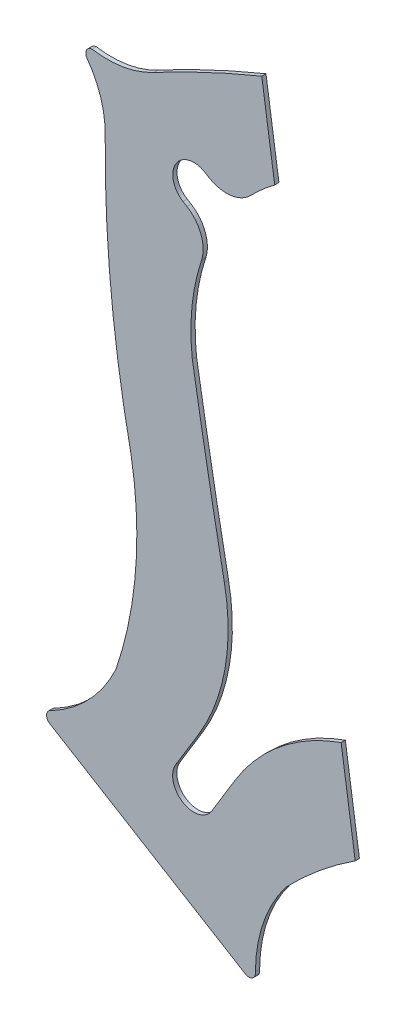
ISO-10303-21;
HEADER;
FILE_DESCRIPTION(('STEP AP214'),'2;1');
FILE_NAME('part.step','',(''),(''),'','','');
FILE_SCHEMA(('AUTOMOTIVE_DESIGN { 1 0 10303 214 1 1 1 1 }'));
ENDSEC;
DATA;
#1=APPLICATION_CONTEXT('core data for automotive mechanical design processes');
#2=APPLICATION_PROTOCOL_DEFINITION('international standard','automotive_design',2000,#1);
#3=PRODUCT_CONTEXT('',#1,'mechanical');
#4=PRODUCT('Part','Part','',(#3));
#5=PRODUCT_RELATED_PRODUCT_CATEGORY('part','',(#4));
#6=PRODUCT_DEFINITION_FORMATION('','',#4);
#7=PRODUCT_DEFINITION_CONTEXT('part definition',#1,'design');
#8=PRODUCT_DEFINITION('design','',#6,#7);
#9=PRODUCT_DEFINITION_SHAPE('','',#8);
#10=(LENGTH_UNIT() NAMED_UNIT(*) SI_UNIT(.MILLI.,.METRE.));
#11=(NAMED_UNIT(*) PLANE_ANGLE_UNIT() SI_UNIT($,.RADIAN.));
#12=(NAMED_UNIT(*) SI_UNIT($,.STERADIAN.) SOLID_ANGLE_UNIT());
#13=UNCERTAINTY_MEASURE_WITH_UNIT(LENGTH_MEASURE(1.E-05),#10,'distance_accuracy_value','');
#14=(GEOMETRIC_REPRESENTATION_CONTEXT(3) GLOBAL_UNCERTAINTY_ASSIGNED_CONTEXT((#13)) GLOBAL_UNIT_ASSIGNED_CONTEXT((#10,
#11,#12)) REPRESENTATION_CONTEXT('',''));
#15=CARTESIAN_POINT('',(0.,0.,0.));
#16=DIRECTION('',(0.,0.,1.));
#17=DIRECTION('',(1.,0.,0.));
#18=AXIS2_PLACEMENT_3D('',#15,#16,#17);
#19=CARTESIAN_POINT('',(-600.745447716728,679.701236138692,0.));
#20=DIRECTION('',(-0.989272155517059,-0.14608423021884,0.));
#21=DIRECTION('',(0.146084230218841,-0.989272155517059,0.));
#22=AXIS2_PLACEMENT_3D('',#19,#20,#21);
#23=PLANE('',#22);
#24=DIRECTION('',(0.146084230218841,-0.989272155517059,0.));
#25=VECTOR('',#24,1.);
#26=CARTESIAN_POINT('',(-231.23791311845,-1822.57785780754,6.35));
#27=LINE('',#26,#25);
#28=CARTESIAN_POINT('',(-591.383250780429,616.301095482348,6.35));
#29=VERTEX_POINT('',#28);
#30=CARTESIAN_POINT('',(-571.935506563414,484.602336398707,6.35));
#31=VERTEX_POINT('',#30);
#32=EDGE_CURVE('E38',#29,#31,#27,.T.);
#33=ORIENTED_EDGE('',*,*,#32,.T.);
#34=DIRECTION('',(0.,0.,-1.));
#35=VECTOR('',#34,1.);
#36=CARTESIAN_POINT('',(-571.935506563414,484.602336398707,6.35));
#37=LINE('',#36,#35);
#38=CARTESIAN_POINT('',(-571.935506563414,484.602336398707,0.));
#39=VERTEX_POINT('',#38);
#40=EDGE_CURVE('E296',#31,#39,#37,.T.);
#41=ORIENTED_EDGE('',*,*,#40,.T.);
#42=DIRECTION('',(0.146084230218841,-0.989272155517059,0.));
#43=VECTOR('',#42,1.);
#44=CARTESIAN_POINT('',(-231.23791311845,-1822.57785780754,0.));
#45=LINE('',#44,#43);
#46=CARTESIAN_POINT('',(-591.383250780429,616.301095482348,0.));
#47=VERTEX_POINT('',#46);
#48=EDGE_CURVE('E290',#47,#39,#45,.T.);
#49=ORIENTED_EDGE('',*,*,#48,.F.);
#50=DIRECTION('',(0.,0.,-1.));
#51=VECTOR('',#50,1.);
#52=CARTESIAN_POINT('',(-591.383250780429,616.301095482348,6.35));
#53=LINE('',#52,#51);
#54=EDGE_CURVE('E291',#29,#47,#53,.T.);
#55=ORIENTED_EDGE('',*,*,#54,.F.);
#56=EDGE_LOOP('',(#33,#41,#49,#55));
#57=FACE_BOUND('',#56,.T.);
#58=ADVANCED_FACE('F34',(#57),#23,.F.);
#59=DIRECTION('',(0.,0.,-1.));
#60=VECTOR('',#59,1.);
#61=CARTESIAN_POINT('',(-451.112265587926,-333.604172663373,6.35));
#62=LINE('',#61,#60);
#63=CARTESIAN_POINT('',(-451.112265587926,-333.604172663373,6.35));
#64=VERTEX_POINT('',#63);
#65=CARTESIAN_POINT('',(-451.112265587926,-333.604172663373,0.));
#66=VERTEX_POINT('',#65);
#67=EDGE_CURVE('E295',#64,#66,#62,.T.);
#68=ORIENTED_EDGE('',*,*,#67,.T.);
#69=CARTESIAN_POINT('',(-472.255241426129,-190.425424004661,0.));
#70=VERTEX_POINT('',#69);
#71=EDGE_CURVE('E286',#70,#66,#45,.T.);
#72=ORIENTED_EDGE('',*,*,#71,.F.);
#73=DIRECTION('',(0.,0.,-1.));
#74=VECTOR('',#73,1.);
#75=CARTESIAN_POINT('',(-472.255241426129,-190.425424004661,6.35));
#76=LINE('',#75,#74);
#77=CARTESIAN_POINT('',(-472.255241426129,-190.425424004661,6.35));
#78=VERTEX_POINT('',#77);
#79=EDGE_CURVE('E294',#78,#70,#76,.T.);
#80=ORIENTED_EDGE('',*,*,#79,.F.);
#81=EDGE_CURVE('E321',#78,#64,#27,.T.);
#82=ORIENTED_EDGE('',*,*,#81,.T.);
#83=EDGE_LOOP('',(#68,#72,#80,#82));
#84=FACE_BOUND('',#83,.T.);
#85=ADVANCED_FACE('F317',(#84),#23,.F.);
#86=CARTESIAN_POINT('',(-171.293236978546,-1813.72592376616,6.35));
#87=DIRECTION('',(0.,0.,1.));
#88=DIRECTION('',(1.,0.,0.));
#89=AXIS2_PLACEMENT_3D('',#86,#87,#88);
#90=PLANE('',#89);
#91=ORIENTED_EDGE('',*,*,#32,.F.);
#92=CARTESIAN_POINT('',(110.064895271897,-1087.99237658831,6.35));
#93=DIRECTION('',(0.,0.,1.));
#94=DIRECTION('',(1.,0.,0.));
#95=AXIS2_PLACEMENT_3D('',#92,#93,#94);
#96=CIRCLE('',#95,1842.99911571951);
#97=CARTESIAN_POINT('',(-752.86597428118,540.502651010876,6.35));
#98=VERTEX_POINT('',#97);
#99=EDGE_CURVE('E258',#29,#98,#96,.T.);
#100=ORIENTED_EDGE('',*,*,#99,.T.);
#101=CARTESIAN_POINT('',(-823.095678809118,666.293875778942,6.35));
#102=DIRECTION('',(0.,0.,1.));
#103=DIRECTION('',(1.,0.,0.));
#104=AXIS2_PLACEMENT_3D('',#101,#102,#103);
#105=CIRCLE('',#104,144.068190891438);
#106=CARTESIAN_POINT('',(-846.063879013175,524.068331638242,6.35));
#107=VERTEX_POINT('',#106);
#108=EDGE_CURVE('E255',#107,#98,#105,.T.);
#109=ORIENTED_EDGE('',*,*,#108,.F.);
#110=CARTESIAN_POINT('',(-845.517589964065,514.069431469444,6.35));
#111=DIRECTION('',(0.,0.,1.));
#112=DIRECTION('',(1.,0.,0.));
#113=AXIS2_PLACEMENT_3D('',#110,#111,#112);
#114=CIRCLE('',#113,10.0138122765892);
#115=CARTESIAN_POINT('',(-854.64607479953,509.952733652118,6.35));
#116=VERTEX_POINT('',#115);
#117=EDGE_CURVE('E253',#107,#116,#114,.T.);
#118=ORIENTED_EDGE('',*,*,#117,.T.);
#119=CARTESIAN_POINT('',(-970.34416603136,424.106386542705,6.35));
#120=DIRECTION('',(0.,0.,1.));
#121=DIRECTION('',(1.,0.,0.));
#122=AXIS2_PLACEMENT_3D('',#119,#120,#121);
#123=CIRCLE('',#122,144.068190891392);
#124=CARTESIAN_POINT('',(-826.34498388287,419.647780563352,6.35));
#125=VERTEX_POINT('',#124);
#126=EDGE_CURVE('E250',#125,#116,#123,.T.);
#127=ORIENTED_EDGE('',*,*,#126,.F.);
#128=CARTESIAN_POINT('',(1016.57894003675,402.999922214724,6.35));
#129=DIRECTION('',(0.,0.,1.));
#130=DIRECTION('',(1.,0.,0.));
#131=AXIS2_PLACEMENT_3D('',#128,#129,#130);
#132=CIRCLE('',#131,1842.99911571951);
#133=CARTESIAN_POINT('',(-787.492762656463,26.2094869798327,6.35));
#134=VERTEX_POINT('',#133);
#135=EDGE_CURVE('E248',#125,#134,#132,.T.);
#136=ORIENTED_EDGE('',*,*,#135,.T.);
#137=CARTESIAN_POINT('',(-1369.16408540414,-74.3343643046313,6.35));
#138=DIRECTION('',(0.,0.,1.));
#139=DIRECTION('',(1.,0.,0.));
#140=AXIS2_PLACEMENT_3D('',#137,#138,#139);
#141=CIRCLE('',#140,590.297038564615);
#142=CARTESIAN_POINT('',(-810.194701221515,-264.081093616758,6.35));
#143=VERTEX_POINT('',#142);
#144=EDGE_CURVE('E245',#143,#134,#141,.T.);
#145=ORIENTED_EDGE('',*,*,#144,.F.);
#146=CARTESIAN_POINT('',(-1009.80855362237,-171.875627095615,6.35));
#147=DIRECTION('',(0.,0.,1.));
#148=DIRECTION('',(1.,0.,0.));
#149=AXIS2_PLACEMENT_3D('',#146,#147,#148);
#150=CIRCLE('',#149,219.880736142784);
#151=CARTESIAN_POINT('',(-907.272518096596,-366.385008733996,6.35));
#152=VERTEX_POINT('',#151);
#153=EDGE_CURVE('E242',#152,#143,#150,.T.);
#154=ORIENTED_EDGE('',*,*,#153,.F.);
#155=CARTESIAN_POINT('',(-904.383283640642,-375.972957449347,6.35));
#156=DIRECTION('',(0.,0.,1.));
#157=DIRECTION('',(1.,0.,0.));
#158=AXIS2_PLACEMENT_3D('',#155,#156,#157);
#159=CIRCLE('',#158,10.0138122765347);
#160=CARTESIAN_POINT('',(-909.585552112732,-384.529407592602,6.35));
#161=VERTEX_POINT('',#160);
#162=EDGE_CURVE('E240',#152,#161,#159,.T.);
#163=ORIENTED_EDGE('',*,*,#162,.T.);
#164=DIRECTION('',(-0.854464803909382,0.519509286615842,0.));
#165=VECTOR('',#164,1.);
#166=CARTESIAN_POINT('',(263.872889372188,-1097.98484194168,6.35));
#167=LINE('',#166,#165);
#168=CARTESIAN_POINT('',(-615.960664731816,-563.051512983046,6.35));
#169=VERTEX_POINT('',#168);
#170=EDGE_CURVE('E237',#169,#161,#167,.T.);
#171=ORIENTED_EDGE('',*,*,#170,.F.);
#172=CARTESIAN_POINT('',(-610.758396259745,-554.495062839782,6.35));
#173=DIRECTION('',(0.,0.,1.));
#174=DIRECTION('',(1.,0.,0.));
#175=AXIS2_PLACEMENT_3D('',#172,#173,#174);
#176=CIRCLE('',#175,10.0138122765345);
#177=CARTESIAN_POINT('',(-600.91648528871,-552.647571365407,6.35));
#178=VERTEX_POINT('',#177);
#179=EDGE_CURVE('E234',#169,#178,#176,.T.);
#180=ORIENTED_EDGE('',*,*,#179,.T.);
#181=CARTESIAN_POINT('',(-381.040967339587,-554.162409070056,6.35));
#182=DIRECTION('',(0.,0.,1.));
#183=DIRECTION('',(1.,0.,0.));
#184=AXIS2_PLACEMENT_3D('',#181,#182,#183);
#185=CIRCLE('',#184,219.880736142757);
#186=CARTESIAN_POINT('',(-554.76775075728,-419.379090925625,6.35));
#187=VERTEX_POINT('',#186);
#188=EDGE_CURVE('E231',#187,#178,#185,.T.);
#189=ORIENTED_EDGE('',*,*,#188,.F.);
#190=CARTESIAN_POINT('',(-129.060690383093,-828.309515919683,6.35));
#191=DIRECTION('',(0.,0.,1.));
#192=DIRECTION('',(1.,0.,0.));
#193=AXIS2_PLACEMENT_3D('',#190,#191,#192);
#194=CIRCLE('',#193,590.297038564702);
#195=EDGE_CURVE('E235',#64,#187,#194,.T.);
#196=ORIENTED_EDGE('',*,*,#195,.F.);
#197=ORIENTED_EDGE('',*,*,#81,.F.);
#198=CARTESIAN_POINT('',(-371.51964822107,-478.097772800309,6.35));
#199=DIRECTION('',(0.,0.,1.));
#200=DIRECTION('',(1.,0.,0.));
#201=AXIS2_PLACEMENT_3D('',#198,#199,#200);
#202=CIRCLE('',#201,304.799999999967);
#203=CARTESIAN_POINT('',(-631.960520452372,-319.751342239341,6.35));
#204=VERTEX_POINT('',#203);
#205=EDGE_CURVE('E133',#78,#204,#202,.T.);
#206=ORIENTED_EDGE('',*,*,#205,.T.);
#207=DIRECTION('',(0.51950928661732,0.854464803908484,0.));
#208=VECTOR('',#207,1.);
#209=CARTESIAN_POINT('',(-1170.80997724912,-1206.02596195983,6.35));
#210=LINE('',#209,#208);
#211=CARTESIAN_POINT('',(-666.28027127014,-376.198878227843,6.35));
#212=VERTEX_POINT('',#211);
#213=EDGE_CURVE('E284',#212,#204,#210,.T.);
#214=ORIENTED_EDGE('',*,*,#213,.F.);
#215=CARTESIAN_POINT('',(-693.40952879447,-359.704458377662,6.35));
#216=DIRECTION('',(0.,0.,1.));
#217=DIRECTION('',(1.,0.,0.));
#218=AXIS2_PLACEMENT_3D('',#215,#216,#217);
#219=CIRCLE('',#218,31.7500000002429);
#220=CARTESIAN_POINT('',(-720.538786318799,-343.210038527483,6.35));
#221=VERTEX_POINT('',#220);
#222=EDGE_CURVE('E282',#221,#212,#219,.T.);
#223=ORIENTED_EDGE('',*,*,#222,.F.);
#224=DIRECTION('',(0.51950928661783,0.854464803908174,0.));
#225=VECTOR('',#224,1.);
#226=CARTESIAN_POINT('',(-1225.06849229784,-1173.03712225845,6.35));
#227=LINE('',#226,#225);
#228=CARTESIAN_POINT('',(-686.219035501725,-286.762502540197,6.35));
#229=VERTEX_POINT('',#228);
#230=EDGE_CURVE('E210',#221,#229,#227,.T.);
#231=ORIENTED_EDGE('',*,*,#230,.T.);
#232=CARTESIAN_POINT('',(-946.659907733025,-128.416071979231,6.35));
#233=DIRECTION('',(0.,0.,1.));
#234=DIRECTION('',(1.,0.,0.));
#235=AXIS2_PLACEMENT_3D('',#232,#233,#234);
#236=CIRCLE('',#235,304.799999999966);
#237=CARTESIAN_POINT('',(-647.527286884587,-69.912096521807,6.35));
#238=VERTEX_POINT('',#237);
#239=EDGE_CURVE('E279',#229,#238,#236,.T.);
#240=ORIENTED_EDGE('',*,*,#239,.T.);
#241=CARTESIAN_POINT('',(8561.11829264849,1731.10303067193,6.35));
#242=DIRECTION('',(0.,0.,1.));
#243=DIRECTION('',(1.,0.,0.));
#244=AXIS2_PLACEMENT_3D('',#241,#242,#243);
#245=CIRCLE('',#244,9383.11296414121);
#246=CARTESIAN_POINT('',(-695.643154418037,196.444628962587,6.35));
#247=VERTEX_POINT('',#246);
#248=EDGE_CURVE('E276',#247,#238,#245,.T.);
#249=ORIENTED_EDGE('',*,*,#248,.F.);
#250=CARTESIAN_POINT('',(-383.710406440245,232.868389544285,6.35));
#251=DIRECTION('',(0.,0.,1.));
#252=DIRECTION('',(1.,0.,0.));
#253=AXIS2_PLACEMENT_3D('',#250,#251,#252);
#254=CIRCLE('',#253,314.052112866463);
#255=CARTESIAN_POINT('',(-681.911908037112,331.380287512312,6.35));
#256=VERTEX_POINT('',#255);
#257=EDGE_CURVE('E273',#256,#247,#254,.T.);
#258=ORIENTED_EDGE('',*,*,#257,.F.);
#259=CARTESIAN_POINT('',(-730.147967150811,347.315236559849,6.35));
#260=DIRECTION('',(0.,0.,1.));
#261=DIRECTION('',(1.,0.,0.));
#262=AXIS2_PLACEMENT_3D('',#259,#260,#261);
#263=CIRCLE('',#262,50.7999999996845);
#264=CARTESIAN_POINT('',(-703.756895390692,390.722048598056,6.35));
#265=VERTEX_POINT('',#264);
#266=EDGE_CURVE('E271',#256,#265,#263,.T.);
#267=ORIENTED_EDGE('',*,*,#266,.T.);
#268=DIRECTION('',(0.854464803907168,-0.519509286619484,0.));
#269=VECTOR('',#268,1.);
#270=CARTESIAN_POINT('',(663.559947286458,-440.598088023026,6.35));
#271=LINE('',#270,#269);
#272=CARTESIAN_POINT('',(-709.677681467006,394.321849709426,6.35));
#273=VERTEX_POINT('',#272);
#274=EDGE_CURVE('E268',#273,#265,#271,.T.);
#275=ORIENTED_EDGE('',*,*,#274,.F.);
#276=CARTESIAN_POINT('',(-693.183261616703,421.451107233681,6.35));
#277=DIRECTION('',(0.,0.,1.));
#278=DIRECTION('',(1.,0.,0.));
#279=AXIS2_PLACEMENT_3D('',#276,#277,#278);
#280=CIRCLE('',#279,31.7500000002425);
#281=CARTESIAN_POINT('',(-676.688841766166,448.580364757794,6.35));
#282=VERTEX_POINT('',#281);
#283=EDGE_CURVE('E265',#282,#273,#280,.T.);
#284=ORIENTED_EDGE('',*,*,#283,.F.);
#285=DIRECTION('',(0.854464803903144,-0.519509286626102,0.));
#286=VECTOR('',#285,1.);
#287=CARTESIAN_POINT('',(696.548786991636,-386.339572991863,6.35));
#288=LINE('',#287,#286);
#289=CARTESIAN_POINT('',(-670.768055691043,444.980563647084,6.35));
#290=VERTEX_POINT('',#289);
#291=EDGE_CURVE('E262',#282,#290,#288,.T.);
#292=ORIENTED_EDGE('',*,*,#291,.T.);
#293=CARTESIAN_POINT('',(-644.376983930646,488.387375685107,6.35));
#294=DIRECTION('',(0.,0.,1.));
#295=DIRECTION('',(1.,0.,0.));
#296=AXIS2_PLACEMENT_3D('',#293,#294,#295);
#297=CIRCLE('',#296,50.7999999996733);
#298=CARTESIAN_POINT('',(-608.030650775085,452.896756275017,6.35));
#299=VERTEX_POINT('',#298);
#300=EDGE_CURVE('E259',#290,#299,#297,.T.);
#301=ORIENTED_EDGE('',*,*,#300,.T.);
#302=CARTESIAN_POINT('',(-383.332959387474,233.489196968218,6.35));
#303=DIRECTION('',(0.,0.,1.));
#304=DIRECTION('',(1.,0.,0.));
#305=AXIS2_PLACEMENT_3D('',#302,#303,#304);
#306=CIRCLE('',#305,314.052112866462);
#307=EDGE_CURVE('E263',#31,#299,#306,.T.);
#308=ORIENTED_EDGE('',*,*,#307,.F.);
#309=EDGE_LOOP('',(#91,#100,#109,#118,#127,#136,#145,#154,#163,#171,#180,#189,#196,#197,#206,
#214,#223,#231,#240,#249,#258,#267,#275,#284,#292,#301,#308));
#310=FACE_BOUND('',#309,.T.);
#311=ADVANCED_FACE('F486',(#310),#90,.T.);
#312=CARTESIAN_POINT('',(-171.293236978546,-1813.72592376616,0.));
#313=DIRECTION('',(0.,0.,1.));
#314=DIRECTION('',(1.,0.,0.));
#315=AXIS2_PLACEMENT_3D('',#312,#313,#314);
#316=PLANE('',#315);
#317=CARTESIAN_POINT('',(110.064895271897,-1087.99237658831,0.));
#318=DIRECTION('',(0.,0.,1.));
#319=DIRECTION('',(1.,0.,0.));
#320=AXIS2_PLACEMENT_3D('',#317,#318,#319);
#321=CIRCLE('',#320,1842.99911571951);
#322=CARTESIAN_POINT('',(-752.86597428118,540.502651010876,0.));
#323=VERTEX_POINT('',#322);
#324=EDGE_CURVE('E301',#47,#323,#321,.T.);
#325=ORIENTED_EDGE('',*,*,#324,.F.);
#326=ORIENTED_EDGE('',*,*,#48,.T.);
#327=CARTESIAN_POINT('',(-383.332959387474,233.489196968218,0.));
#328=DIRECTION('',(0.,0.,1.));
#329=DIRECTION('',(1.,0.,0.));
#330=AXIS2_PLACEMENT_3D('',#327,#328,#329);
#331=CIRCLE('',#330,314.052112866462);
#332=CARTESIAN_POINT('',(-608.030650775085,452.896756275017,0.));
#333=VERTEX_POINT('',#332);
#334=EDGE_CURVE('E303',#39,#333,#331,.T.);
#335=ORIENTED_EDGE('',*,*,#334,.T.);
#336=CARTESIAN_POINT('',(-644.376983930646,488.387375685107,0.));
#337=DIRECTION('',(0.,0.,1.));
#338=DIRECTION('',(1.,0.,0.));
#339=AXIS2_PLACEMENT_3D('',#336,#337,#338);
#340=CIRCLE('',#339,50.7999999996733);
#341=CARTESIAN_POINT('',(-670.768055691043,444.980563647084,0.));
#342=VERTEX_POINT('',#341);
#343=EDGE_CURVE('E305',#342,#333,#340,.T.);
#344=ORIENTED_EDGE('',*,*,#343,.F.);
#345=DIRECTION('',(0.854464803903144,-0.519509286626102,0.));
#346=VECTOR('',#345,1.);
#347=CARTESIAN_POINT('',(696.548786991636,-386.339572991863,0.));
#348=LINE('',#347,#346);
#349=CARTESIAN_POINT('',(-676.688841766166,448.580364757794,0.));
#350=VERTEX_POINT('',#349);
#351=EDGE_CURVE('E369',#350,#342,#348,.T.);
#352=ORIENTED_EDGE('',*,*,#351,.F.);
#353=CARTESIAN_POINT('',(-693.183261616703,421.451107233681,0.));
#354=DIRECTION('',(0.,0.,1.));
#355=DIRECTION('',(1.,0.,0.));
#356=AXIS2_PLACEMENT_3D('',#353,#354,#355);
#357=CIRCLE('',#356,31.7500000002425);
#358=CARTESIAN_POINT('',(-709.677681467006,394.321849709426,0.));
#359=VERTEX_POINT('',#358);
#360=EDGE_CURVE('E371',#350,#359,#357,.T.);
#361=ORIENTED_EDGE('',*,*,#360,.T.);
#362=DIRECTION('',(0.854464803907168,-0.519509286619484,0.));
#363=VECTOR('',#362,1.);
#364=CARTESIAN_POINT('',(663.559947286458,-440.598088023026,0.));
#365=LINE('',#364,#363);
#366=CARTESIAN_POINT('',(-703.756895390692,390.722048598056,0.));
#367=VERTEX_POINT('',#366);
#368=EDGE_CURVE('E374',#359,#367,#365,.T.);
#369=ORIENTED_EDGE('',*,*,#368,.T.);
#370=CARTESIAN_POINT('',(-730.147967150811,347.315236559849,0.));
#371=DIRECTION('',(0.,0.,1.));
#372=DIRECTION('',(1.,0.,0.));
#373=AXIS2_PLACEMENT_3D('',#370,#371,#372);
#374=CIRCLE('',#373,50.7999999996845);
#375=CARTESIAN_POINT('',(-681.911908037112,331.380287512312,0.));
#376=VERTEX_POINT('',#375);
#377=EDGE_CURVE('E377',#376,#367,#374,.T.);
#378=ORIENTED_EDGE('',*,*,#377,.F.);
#379=CARTESIAN_POINT('',(-383.710406440245,232.868389544285,0.));
#380=DIRECTION('',(0.,0.,1.));
#381=DIRECTION('',(1.,0.,0.));
#382=AXIS2_PLACEMENT_3D('',#379,#380,#381);
#383=CIRCLE('',#382,314.052112866463);
#384=CARTESIAN_POINT('',(-695.643154418037,196.444628962587,0.));
#385=VERTEX_POINT('',#384);
#386=EDGE_CURVE('E380',#376,#385,#383,.T.);
#387=ORIENTED_EDGE('',*,*,#386,.T.);
#388=CARTESIAN_POINT('',(8561.11829264849,1731.10303067193,0.));
#389=DIRECTION('',(0.,0.,1.));
#390=DIRECTION('',(1.,0.,0.));
#391=AXIS2_PLACEMENT_3D('',#388,#389,#390);
#392=CIRCLE('',#391,9383.11296414121);
#393=CARTESIAN_POINT('',(-647.527286884587,-69.912096521807,0.));
#394=VERTEX_POINT('',#393);
#395=EDGE_CURVE('E383',#385,#394,#392,.T.);
#396=ORIENTED_EDGE('',*,*,#395,.T.);
#397=CARTESIAN_POINT('',(-946.659907733025,-128.416071979231,0.));
#398=DIRECTION('',(0.,0.,1.));
#399=DIRECTION('',(1.,0.,0.));
#400=AXIS2_PLACEMENT_3D('',#397,#398,#399);
#401=CIRCLE('',#400,304.799999999966);
#402=CARTESIAN_POINT('',(-686.219035501725,-286.762502540197,0.));
#403=VERTEX_POINT('',#402);
#404=EDGE_CURVE('E224',#403,#394,#401,.T.);
#405=ORIENTED_EDGE('',*,*,#404,.F.);
#406=DIRECTION('',(0.51950928661783,0.854464803908174,0.));
#407=VECTOR('',#406,1.);
#408=CARTESIAN_POINT('',(-1225.06849229784,-1173.03712225845,0.));
#409=LINE('',#408,#407);
#410=CARTESIAN_POINT('',(-720.538786318799,-343.210038527483,0.));
#411=VERTEX_POINT('',#410);
#412=EDGE_CURVE('E208',#411,#403,#409,.T.);
#413=ORIENTED_EDGE('',*,*,#412,.F.);
#414=CARTESIAN_POINT('',(-693.40952879447,-359.704458377662,0.));
#415=DIRECTION('',(0.,0.,1.));
#416=DIRECTION('',(1.,0.,0.));
#417=AXIS2_PLACEMENT_3D('',#414,#415,#416);
#418=CIRCLE('',#417,31.7500000002429);
#419=CARTESIAN_POINT('',(-666.28027127014,-376.198878227843,0.));
#420=VERTEX_POINT('',#419);
#421=EDGE_CURVE('E221',#411,#420,#418,.T.);
#422=ORIENTED_EDGE('',*,*,#421,.T.);
#423=DIRECTION('',(0.51950928661732,0.854464803908484,0.));
#424=VECTOR('',#423,1.);
#425=CARTESIAN_POINT('',(-1170.80997724912,-1206.02596195983,0.));
#426=LINE('',#425,#424);
#427=CARTESIAN_POINT('',(-631.960520452372,-319.751342239341,0.));
#428=VERTEX_POINT('',#427);
#429=EDGE_CURVE('E44',#420,#428,#426,.T.);
#430=ORIENTED_EDGE('',*,*,#429,.T.);
#431=CARTESIAN_POINT('',(-371.51964822107,-478.097772800309,0.));
#432=DIRECTION('',(0.,0.,1.));
#433=DIRECTION('',(1.,0.,0.));
#434=AXIS2_PLACEMENT_3D('',#431,#432,#433);
#435=CIRCLE('',#434,304.799999999967);
#436=EDGE_CURVE('E11',#70,#428,#435,.T.);
#437=ORIENTED_EDGE('',*,*,#436,.F.);
#438=ORIENTED_EDGE('',*,*,#71,.T.);
#439=CARTESIAN_POINT('',(-129.060690383093,-828.309515919683,0.));
#440=DIRECTION('',(0.,0.,1.));
#441=DIRECTION('',(1.,0.,0.));
#442=AXIS2_PLACEMENT_3D('',#439,#440,#441);
#443=CIRCLE('',#442,590.297038564702);
#444=CARTESIAN_POINT('',(-554.76775075728,-419.379090925625,0.));
#445=VERTEX_POINT('',#444);
#446=EDGE_CURVE('E141',#66,#445,#443,.T.);
#447=ORIENTED_EDGE('',*,*,#446,.T.);
#448=CARTESIAN_POINT('',(-381.040967339587,-554.162409070056,0.));
#449=DIRECTION('',(0.,0.,1.));
#450=DIRECTION('',(1.,0.,0.));
#451=AXIS2_PLACEMENT_3D('',#448,#449,#450);
#452=CIRCLE('',#451,219.880736142757);
#453=CARTESIAN_POINT('',(-600.91648528871,-552.647571365407,0.));
#454=VERTEX_POINT('',#453);
#455=EDGE_CURVE('E308',#445,#454,#452,.T.);
#456=ORIENTED_EDGE('',*,*,#455,.T.);
#457=CARTESIAN_POINT('',(-610.758396259745,-554.495062839782,0.));
#458=DIRECTION('',(0.,0.,1.));
#459=DIRECTION('',(1.,0.,0.));
#460=AXIS2_PLACEMENT_3D('',#457,#458,#459);
#461=CIRCLE('',#460,10.0138122765345);
#462=CARTESIAN_POINT('',(-615.960664731816,-563.051512983046,0.));
#463=VERTEX_POINT('',#462);
#464=EDGE_CURVE('E339',#463,#454,#461,.T.);
#465=ORIENTED_EDGE('',*,*,#464,.F.);
#466=DIRECTION('',(-0.854464803909382,0.519509286615842,0.));
#467=VECTOR('',#466,1.);
#468=CARTESIAN_POINT('',(263.872889372188,-1097.98484194168,0.));
#469=LINE('',#468,#467);
#470=CARTESIAN_POINT('',(-909.585552112732,-384.529407592602,0.));
#471=VERTEX_POINT('',#470);
#472=EDGE_CURVE('E341',#463,#471,#469,.T.);
#473=ORIENTED_EDGE('',*,*,#472,.T.);
#474=CARTESIAN_POINT('',(-904.383283640642,-375.972957449347,0.));
#475=DIRECTION('',(0.,0.,1.));
#476=DIRECTION('',(1.,0.,0.));
#477=AXIS2_PLACEMENT_3D('',#474,#475,#476);
#478=CIRCLE('',#477,10.0138122765347);
#479=CARTESIAN_POINT('',(-907.272518096596,-366.385008733996,0.));
#480=VERTEX_POINT('',#479);
#481=EDGE_CURVE('E347',#480,#471,#478,.T.);
#482=ORIENTED_EDGE('',*,*,#481,.F.);
#483=CARTESIAN_POINT('',(-1009.80855362237,-171.875627095615,0.));
#484=DIRECTION('',(0.,0.,1.));
#485=DIRECTION('',(1.,0.,0.));
#486=AXIS2_PLACEMENT_3D('',#483,#484,#485);
#487=CIRCLE('',#486,219.880736142784);
#488=CARTESIAN_POINT('',(-810.194701221515,-264.081093616758,0.));
#489=VERTEX_POINT('',#488);
#490=EDGE_CURVE('E350',#480,#489,#487,.T.);
#491=ORIENTED_EDGE('',*,*,#490,.T.);
#492=CARTESIAN_POINT('',(-1369.16408540414,-74.3343643046313,0.));
#493=DIRECTION('',(0.,0.,1.));
#494=DIRECTION('',(1.,0.,0.));
#495=AXIS2_PLACEMENT_3D('',#492,#493,#494);
#496=CIRCLE('',#495,590.297038564615);
#497=CARTESIAN_POINT('',(-787.492762656463,26.2094869798327,0.));
#498=VERTEX_POINT('',#497);
#499=EDGE_CURVE('E353',#489,#498,#496,.T.);
#500=ORIENTED_EDGE('',*,*,#499,.T.);
#501=CARTESIAN_POINT('',(1016.57894003675,402.999922214724,0.));
#502=DIRECTION('',(0.,0.,1.));
#503=DIRECTION('',(1.,0.,0.));
#504=AXIS2_PLACEMENT_3D('',#501,#502,#503);
#505=CIRCLE('',#504,1842.99911571951);
#506=CARTESIAN_POINT('',(-826.34498388287,419.647780563352,0.));
#507=VERTEX_POINT('',#506);
#508=EDGE_CURVE('E356',#507,#498,#505,.T.);
#509=ORIENTED_EDGE('',*,*,#508,.F.);
#510=CARTESIAN_POINT('',(-970.34416603136,424.106386542705,0.));
#511=DIRECTION('',(0.,0.,1.));
#512=DIRECTION('',(1.,0.,0.));
#513=AXIS2_PLACEMENT_3D('',#510,#511,#512);
#514=CIRCLE('',#513,144.068190891392);
#515=CARTESIAN_POINT('',(-854.64607479953,509.952733652118,0.));
#516=VERTEX_POINT('',#515);
#517=EDGE_CURVE('E359',#507,#516,#514,.T.);
#518=ORIENTED_EDGE('',*,*,#517,.T.);
#519=CARTESIAN_POINT('',(-845.517589964065,514.069431469444,0.));
#520=DIRECTION('',(0.,0.,1.));
#521=DIRECTION('',(1.,0.,0.));
#522=AXIS2_PLACEMENT_3D('',#519,#520,#521);
#523=CIRCLE('',#522,10.0138122765892);
#524=CARTESIAN_POINT('',(-846.063879013175,524.068331638242,0.));
#525=VERTEX_POINT('',#524);
#526=EDGE_CURVE('E362',#525,#516,#523,.T.);
#527=ORIENTED_EDGE('',*,*,#526,.F.);
#528=CARTESIAN_POINT('',(-823.095678809118,666.293875778942,0.));
#529=DIRECTION('',(0.,0.,1.));
#530=DIRECTION('',(1.,0.,0.));
#531=AXIS2_PLACEMENT_3D('',#528,#529,#530);
#532=CIRCLE('',#531,144.068190891438);
#533=EDGE_CURVE('E304',#525,#323,#532,.T.);
#534=ORIENTED_EDGE('',*,*,#533,.T.);
#535=EDGE_LOOP('',(#325,#326,#335,#344,#352,#361,#369,#378,#387,#396,#405,#413,#422,#430,#437,
#438,#447,#456,#465,#473,#482,#491,#500,#509,#518,#527,#534));
#536=FACE_BOUND('',#535,.T.);
#537=ADVANCED_FACE('F36',(#536),#316,.F.);
#538=CARTESIAN_POINT('',(110.064895271897,-1087.99237658831,6.35));
#539=DIRECTION('',(0.,0.,-1.));
#540=DIRECTION('',(-1.,0.,0.));
#541=AXIS2_PLACEMENT_3D('',#538,#539,#540);
#542=CYLINDRICAL_SURFACE('',#541,1842.99911571951);
#543=ORIENTED_EDGE('',*,*,#99,.F.);
#544=ORIENTED_EDGE('',*,*,#54,.T.);
#545=ORIENTED_EDGE('',*,*,#324,.T.);
#546=DIRECTION('',(0.,0.,-1.));
#547=VECTOR('',#546,1.);
#548=CARTESIAN_POINT('',(-752.86597428118,540.502651010876,6.35));
#549=LINE('',#548,#547);
#550=EDGE_CURVE('E289',#98,#323,#549,.T.);
#551=ORIENTED_EDGE('',*,*,#550,.F.);
#552=EDGE_LOOP('',(#543,#544,#545,#551));
#553=FACE_BOUND('',#552,.T.);
#554=ADVANCED_FACE('F470',(#553),#542,.T.);
#555=CARTESIAN_POINT('',(-823.095678809118,666.293875778942,6.35));
#556=DIRECTION('',(0.,0.,-1.));
#557=DIRECTION('',(-1.,0.,0.));
#558=AXIS2_PLACEMENT_3D('',#555,#556,#557);
#559=CYLINDRICAL_SURFACE('',#558,144.068190891438);
#560=ORIENTED_EDGE('',*,*,#533,.F.);
#561=DIRECTION('',(0.,0.,-1.));
#562=VECTOR('',#561,1.);
#563=CARTESIAN_POINT('',(-846.063879013175,524.068331638242,6.35));
#564=LINE('',#563,#562);
#565=EDGE_CURVE('E415',#107,#525,#564,.T.);
#566=ORIENTED_EDGE('',*,*,#565,.F.);
#567=ORIENTED_EDGE('',*,*,#108,.T.);
#568=ORIENTED_EDGE('',*,*,#550,.T.);
#569=EDGE_LOOP('',(#560,#566,#567,#568));
#570=FACE_BOUND('',#569,.T.);
#571=ADVANCED_FACE('F465',(#570),#559,.F.);
#572=CARTESIAN_POINT('',(-845.517589964065,514.069431469444,6.35));
#573=DIRECTION('',(0.,0.,-1.));
#574=DIRECTION('',(-1.,0.,0.));
#575=AXIS2_PLACEMENT_3D('',#572,#573,#574);
#576=CYLINDRICAL_SURFACE('',#575,10.0138122765892);
#577=ORIENTED_EDGE('',*,*,#526,.T.);
#578=DIRECTION('',(0.,0.,-1.));
#579=VECTOR('',#578,1.);
#580=CARTESIAN_POINT('',(-854.64607479953,509.952733652118,6.35));
#581=LINE('',#580,#579);
#582=EDGE_CURVE('E417',#116,#516,#581,.T.);
#583=ORIENTED_EDGE('',*,*,#582,.F.);
#584=ORIENTED_EDGE('',*,*,#117,.F.);
#585=ORIENTED_EDGE('',*,*,#565,.T.);
#586=EDGE_LOOP('',(#577,#583,#584,#585));
#587=FACE_BOUND('',#586,.T.);
#588=ADVANCED_FACE('F462',(#587),#576,.T.);
#589=CARTESIAN_POINT('',(-970.34416603136,424.106386542705,6.35));
#590=DIRECTION('',(0.,0.,-1.));
#591=DIRECTION('',(-1.,0.,0.));
#592=AXIS2_PLACEMENT_3D('',#589,#590,#591);
#593=CYLINDRICAL_SURFACE('',#592,144.068190891392);
#594=ORIENTED_EDGE('',*,*,#517,.F.);
#595=DIRECTION('',(0.,0.,-1.));
#596=VECTOR('',#595,1.);
#597=CARTESIAN_POINT('',(-826.34498388287,419.647780563352,6.35));
#598=LINE('',#597,#596);
#599=EDGE_CURVE('E419',#125,#507,#598,.T.);
#600=ORIENTED_EDGE('',*,*,#599,.F.);
#601=ORIENTED_EDGE('',*,*,#126,.T.);
#602=ORIENTED_EDGE('',*,*,#582,.T.);
#603=EDGE_LOOP('',(#594,#600,#601,#602));
#604=FACE_BOUND('',#603,.T.);
#605=ADVANCED_FACE('F456',(#604),#593,.F.);
#606=CARTESIAN_POINT('',(1016.57894003675,402.999922214724,6.35));
#607=DIRECTION('',(0.,0.,-1.));
#608=DIRECTION('',(-1.,0.,0.));
#609=AXIS2_PLACEMENT_3D('',#606,#607,#608);
#610=CYLINDRICAL_SURFACE('',#609,1842.99911571951);
#611=ORIENTED_EDGE('',*,*,#508,.T.);
#612=DIRECTION('',(0.,0.,-1.));
#613=VECTOR('',#612,1.);
#614=CARTESIAN_POINT('',(-787.492762656463,26.2094869798327,6.35));
#615=LINE('',#614,#613);
#616=EDGE_CURVE('E421',#134,#498,#615,.T.);
#617=ORIENTED_EDGE('',*,*,#616,.F.);
#618=ORIENTED_EDGE('',*,*,#135,.F.);
#619=ORIENTED_EDGE('',*,*,#599,.T.);
#620=EDGE_LOOP('',(#611,#617,#618,#619));
#621=FACE_BOUND('',#620,.T.);
#622=ADVANCED_FACE('F521',(#621),#610,.T.);
#623=CARTESIAN_POINT('',(-1369.16408540414,-74.3343643046313,6.35));
#624=DIRECTION('',(0.,0.,-1.));
#625=DIRECTION('',(-1.,0.,0.));
#626=AXIS2_PLACEMENT_3D('',#623,#624,#625);
#627=CYLINDRICAL_SURFACE('',#626,590.297038564615);
#628=ORIENTED_EDGE('',*,*,#499,.F.);
#629=DIRECTION('',(0.,0.,-1.));
#630=VECTOR('',#629,1.);
#631=CARTESIAN_POINT('',(-810.194701221515,-264.081093616758,6.35));
#632=LINE('',#631,#630);
#633=EDGE_CURVE('E423',#143,#489,#632,.T.);
#634=ORIENTED_EDGE('',*,*,#633,.F.);
#635=ORIENTED_EDGE('',*,*,#144,.T.);
#636=ORIENTED_EDGE('',*,*,#616,.T.);
#637=EDGE_LOOP('',(#628,#634,#635,#636));
#638=FACE_BOUND('',#637,.T.);
#639=ADVANCED_FACE('F449',(#638),#627,.F.);
#640=CARTESIAN_POINT('',(-1009.80855362237,-171.875627095615,6.35));
#641=DIRECTION('',(0.,0.,-1.));
#642=DIRECTION('',(-1.,0.,0.));
#643=AXIS2_PLACEMENT_3D('',#640,#641,#642);
#644=CYLINDRICAL_SURFACE('',#643,219.880736142784);
#645=ORIENTED_EDGE('',*,*,#490,.F.);
#646=DIRECTION('',(0.,0.,-1.));
#647=VECTOR('',#646,1.);
#648=CARTESIAN_POINT('',(-907.272518096596,-366.385008733996,6.35));
#649=LINE('',#648,#647);
#650=EDGE_CURVE('E425',#152,#480,#649,.T.);
#651=ORIENTED_EDGE('',*,*,#650,.F.);
#652=ORIENTED_EDGE('',*,*,#153,.T.);
#653=ORIENTED_EDGE('',*,*,#633,.T.);
#654=EDGE_LOOP('',(#645,#651,#652,#653));
#655=FACE_BOUND('',#654,.T.);
#656=ADVANCED_FACE('F444',(#655),#644,.F.);
#657=CARTESIAN_POINT('',(-904.383283640642,-375.972957449347,6.35));
#658=DIRECTION('',(0.,0.,-1.));
#659=DIRECTION('',(-1.,0.,0.));
#660=AXIS2_PLACEMENT_3D('',#657,#658,#659);
#661=CYLINDRICAL_SURFACE('',#660,10.0138122765347);
#662=ORIENTED_EDGE('',*,*,#481,.T.);
#663=DIRECTION('',(0.,0.,-1.));
#664=VECTOR('',#663,1.);
#665=CARTESIAN_POINT('',(-909.585552112732,-384.529407592602,6.35));
#666=LINE('',#665,#664);
#667=EDGE_CURVE('E427',#161,#471,#666,.T.);
#668=ORIENTED_EDGE('',*,*,#667,.F.);
#669=ORIENTED_EDGE('',*,*,#162,.F.);
#670=ORIENTED_EDGE('',*,*,#650,.T.);
#671=EDGE_LOOP('',(#662,#668,#669,#670));
#672=FACE_BOUND('',#671,.T.);
#673=ADVANCED_FACE('F441',(#672),#661,.T.);
#674=CARTESIAN_POINT('',(263.872889372188,-1097.98484194168,6.35));
#675=DIRECTION('',(-0.519509286615842,-0.854464803909382,0.));
#676=DIRECTION('',(0.854464803909382,-0.519509286615842,0.));
#677=AXIS2_PLACEMENT_3D('',#674,#675,#676);
#678=PLANE('',#677);
#679=ORIENTED_EDGE('',*,*,#472,.F.);
#680=DIRECTION('',(0.,0.,-1.));
#681=VECTOR('',#680,1.);
#682=CARTESIAN_POINT('',(-615.960664731816,-563.051512983046,6.35));
#683=LINE('',#682,#681);
#684=EDGE_CURVE('E429',#169,#463,#683,.T.);
#685=ORIENTED_EDGE('',*,*,#684,.F.);
#686=ORIENTED_EDGE('',*,*,#170,.T.);
#687=ORIENTED_EDGE('',*,*,#667,.T.);
#688=EDGE_LOOP('',(#679,#685,#686,#687));
#689=FACE_BOUND('',#688,.T.);
#690=ADVANCED_FACE('F437',(#689),#678,.T.);
#691=CARTESIAN_POINT('',(-610.758396259745,-554.495062839782,6.35));
#692=DIRECTION('',(0.,0.,-1.));
#693=DIRECTION('',(-1.,0.,0.));
#694=AXIS2_PLACEMENT_3D('',#691,#692,#693);
#695=CYLINDRICAL_SURFACE('',#694,10.0138122765345);
#696=ORIENTED_EDGE('',*,*,#464,.T.);
#697=DIRECTION('',(0.,0.,-1.));
#698=VECTOR('',#697,1.);
#699=CARTESIAN_POINT('',(-600.91648528871,-552.647571365407,6.35));
#700=LINE('',#699,#698);
#701=EDGE_CURVE('E333',#178,#454,#700,.T.);
#702=ORIENTED_EDGE('',*,*,#701,.F.);
#703=ORIENTED_EDGE('',*,*,#179,.F.);
#704=ORIENTED_EDGE('',*,*,#684,.T.);
#705=EDGE_LOOP('',(#696,#702,#703,#704));
#706=FACE_BOUND('',#705,.T.);
#707=ADVANCED_FACE('F432',(#706),#695,.T.);
#708=CARTESIAN_POINT('',(-381.040967339587,-554.162409070056,6.35));
#709=DIRECTION('',(0.,0.,-1.));
#710=DIRECTION('',(-1.,0.,0.));
#711=AXIS2_PLACEMENT_3D('',#708,#709,#710);
#712=CYLINDRICAL_SURFACE('',#711,219.880736142757);
#713=ORIENTED_EDGE('',*,*,#455,.F.);
#714=DIRECTION('',(0.,0.,-1.));
#715=VECTOR('',#714,1.);
#716=CARTESIAN_POINT('',(-554.76775075728,-419.379090925625,6.35));
#717=LINE('',#716,#715);
#718=EDGE_CURVE('E328',#187,#445,#717,.T.);
#719=ORIENTED_EDGE('',*,*,#718,.F.);
#720=ORIENTED_EDGE('',*,*,#188,.T.);
#721=ORIENTED_EDGE('',*,*,#701,.T.);
#722=EDGE_LOOP('',(#713,#719,#720,#721));
#723=FACE_BOUND('',#722,.T.);
#724=ADVANCED_FACE('F335',(#723),#712,.F.);
#725=CARTESIAN_POINT('',(-129.060690383093,-828.309515919683,6.35));
#726=DIRECTION('',(0.,0.,-1.));
#727=DIRECTION('',(-1.,0.,0.));
#728=AXIS2_PLACEMENT_3D('',#725,#726,#727);
#729=CYLINDRICAL_SURFACE('',#728,590.297038564702);
#730=ORIENTED_EDGE('',*,*,#67,.F.);
#731=ORIENTED_EDGE('',*,*,#195,.T.);
#732=ORIENTED_EDGE('',*,*,#718,.T.);
#733=ORIENTED_EDGE('',*,*,#446,.F.);
#734=EDGE_LOOP('',(#730,#731,#732,#733));
#735=FACE_BOUND('',#734,.T.);
#736=ADVANCED_FACE('F326',(#735),#729,.F.);
#737=CARTESIAN_POINT('',(-371.51964822107,-478.097772800309,6.35));
#738=DIRECTION('',(0.,0.,-1.));
#739=DIRECTION('',(-1.,0.,0.));
#740=AXIS2_PLACEMENT_3D('',#737,#738,#739);
#741=CYLINDRICAL_SURFACE('',#740,304.799999999967);
#742=ORIENTED_EDGE('',*,*,#205,.F.);
#743=ORIENTED_EDGE('',*,*,#79,.T.);
#744=ORIENTED_EDGE('',*,*,#436,.T.);
#745=DIRECTION('',(0.,0.,-1.));
#746=VECTOR('',#745,1.);
#747=CARTESIAN_POINT('',(-631.960520452372,-319.751342239341,6.35));
#748=LINE('',#747,#746);
#749=EDGE_CURVE('E332',#204,#428,#748,.T.);
#750=ORIENTED_EDGE('',*,*,#749,.F.);
#751=EDGE_LOOP('',(#742,#743,#744,#750));
#752=FACE_BOUND('',#751,.T.);
#753=ADVANCED_FACE('F478',(#752),#741,.T.);
#754=CARTESIAN_POINT('',(-1170.80997724912,-1206.02596195983,6.35));
#755=DIRECTION('',(-0.854464803908484,0.51950928661732,0.));
#756=DIRECTION('',(-0.51950928661732,-0.854464803908484,0.));
#757=AXIS2_PLACEMENT_3D('',#754,#755,#756);
#758=PLANE('',#757);
#759=ORIENTED_EDGE('',*,*,#429,.F.);
#760=DIRECTION('',(0.,0.,-1.));
#761=VECTOR('',#760,1.);
#762=CARTESIAN_POINT('',(-666.28027127014,-376.198878227843,6.35));
#763=LINE('',#762,#761);
#764=EDGE_CURVE('E126',#212,#420,#763,.T.);
#765=ORIENTED_EDGE('',*,*,#764,.F.);
#766=ORIENTED_EDGE('',*,*,#213,.T.);
#767=ORIENTED_EDGE('',*,*,#749,.T.);
#768=EDGE_LOOP('',(#759,#765,#766,#767));
#769=FACE_BOUND('',#768,.T.);
#770=ADVANCED_FACE('F484',(#769),#758,.T.);
#771=CARTESIAN_POINT('',(-693.40952879447,-359.704458377662,6.35));
#772=DIRECTION('',(0.,0.,-1.));
#773=DIRECTION('',(-1.,0.,0.));
#774=AXIS2_PLACEMENT_3D('',#771,#772,#773);
#775=CYLINDRICAL_SURFACE('',#774,31.7500000002429);
#776=ORIENTED_EDGE('',*,*,#421,.F.);
#777=DIRECTION('',(0.,0.,-1.));
#778=VECTOR('',#777,1.);
#779=CARTESIAN_POINT('',(-720.538786318799,-343.210038527483,6.35));
#780=LINE('',#779,#778);
#781=EDGE_CURVE('E204',#221,#411,#780,.T.);
#782=ORIENTED_EDGE('',*,*,#781,.F.);
#783=ORIENTED_EDGE('',*,*,#222,.T.);
#784=ORIENTED_EDGE('',*,*,#764,.T.);
#785=EDGE_LOOP('',(#776,#782,#783,#784));
#786=FACE_BOUND('',#785,.T.);
#787=ADVANCED_FACE('F226',(#786),#775,.F.);
#788=CARTESIAN_POINT('',(-1225.06849229784,-1173.03712225845,6.35));
#789=DIRECTION('',(-0.854464803908174,0.51950928661783,0.));
#790=DIRECTION('',(-0.51950928661783,-0.854464803908174,0.));
#791=AXIS2_PLACEMENT_3D('',#788,#789,#790);
#792=PLANE('',#791);
#793=ORIENTED_EDGE('',*,*,#412,.T.);
#794=DIRECTION('',(0.,0.,-1.));
#795=VECTOR('',#794,1.);
#796=CARTESIAN_POINT('',(-686.219035501725,-286.762502540197,6.35));
#797=LINE('',#796,#795);
#798=EDGE_CURVE('E215',#229,#403,#797,.T.);
#799=ORIENTED_EDGE('',*,*,#798,.F.);
#800=ORIENTED_EDGE('',*,*,#230,.F.);
#801=ORIENTED_EDGE('',*,*,#781,.T.);
#802=EDGE_LOOP('',(#793,#799,#800,#801));
#803=FACE_BOUND('',#802,.T.);
#804=ADVANCED_FACE('F206',(#803),#792,.F.);
#805=CARTESIAN_POINT('',(-946.659907733025,-128.416071979231,6.35));
#806=DIRECTION('',(0.,0.,-1.));
#807=DIRECTION('',(-1.,0.,0.));
#808=AXIS2_PLACEMENT_3D('',#805,#806,#807);
#809=CYLINDRICAL_SURFACE('',#808,304.799999999966);
#810=ORIENTED_EDGE('',*,*,#404,.T.);
#811=DIRECTION('',(0.,0.,-1.));
#812=VECTOR('',#811,1.);
#813=CARTESIAN_POINT('',(-647.527286884587,-69.912096521807,6.35));
#814=LINE('',#813,#812);
#815=EDGE_CURVE('E388',#238,#394,#814,.T.);
#816=ORIENTED_EDGE('',*,*,#815,.F.);
#817=ORIENTED_EDGE('',*,*,#239,.F.);
#818=ORIENTED_EDGE('',*,*,#798,.T.);
#819=EDGE_LOOP('',(#810,#816,#817,#818));
#820=FACE_BOUND('',#819,.T.);
#821=ADVANCED_FACE('F386',(#820),#809,.T.);
#822=CARTESIAN_POINT('',(8561.11829264849,1731.10303067193,6.35));
#823=DIRECTION('',(0.,0.,-1.));
#824=DIRECTION('',(-1.,0.,0.));
#825=AXIS2_PLACEMENT_3D('',#822,#823,#824);
#826=CYLINDRICAL_SURFACE('',#825,9383.11296414121);
#827=ORIENTED_EDGE('',*,*,#395,.F.);
#828=DIRECTION('',(0.,0.,-1.));
#829=VECTOR('',#828,1.);
#830=CARTESIAN_POINT('',(-695.643154418037,196.444628962587,6.35));
#831=LINE('',#830,#829);
#832=EDGE_CURVE('E394',#247,#385,#831,.T.);
#833=ORIENTED_EDGE('',*,*,#832,.F.);
#834=ORIENTED_EDGE('',*,*,#248,.T.);
#835=ORIENTED_EDGE('',*,*,#815,.T.);
#836=EDGE_LOOP('',(#827,#833,#834,#835));
#837=FACE_BOUND('',#836,.T.);
#838=ADVANCED_FACE('F393',(#837),#826,.F.);
#839=CARTESIAN_POINT('',(-383.710406440245,232.868389544285,6.35));
#840=DIRECTION('',(0.,0.,-1.));
#841=DIRECTION('',(-1.,0.,0.));
#842=AXIS2_PLACEMENT_3D('',#839,#840,#841);
#843=CYLINDRICAL_SURFACE('',#842,314.052112866463);
#844=ORIENTED_EDGE('',*,*,#386,.F.);
#845=DIRECTION('',(0.,0.,-1.));
#846=VECTOR('',#845,1.);
#847=CARTESIAN_POINT('',(-681.911908037112,331.380287512312,6.35));
#848=LINE('',#847,#846);
#849=EDGE_CURVE('E397',#256,#376,#848,.T.);
#850=ORIENTED_EDGE('',*,*,#849,.F.);
#851=ORIENTED_EDGE('',*,*,#257,.T.);
#852=ORIENTED_EDGE('',*,*,#832,.T.);
#853=EDGE_LOOP('',(#844,#850,#851,#852));
#854=FACE_BOUND('',#853,.T.);
#855=ADVANCED_FACE('F489',(#854),#843,.F.);
#856=CARTESIAN_POINT('',(-730.147967150811,347.315236559849,6.35));
#857=DIRECTION('',(0.,0.,-1.));
#858=DIRECTION('',(-1.,0.,0.));
#859=AXIS2_PLACEMENT_3D('',#856,#857,#858);
#860=CYLINDRICAL_SURFACE('',#859,50.7999999996845);
#861=ORIENTED_EDGE('',*,*,#377,.T.);
#862=DIRECTION('',(0.,0.,-1.));
#863=VECTOR('',#862,1.);
#864=CARTESIAN_POINT('',(-703.756895390692,390.722048598056,6.35));
#865=LINE('',#864,#863);
#866=EDGE_CURVE('E402',#265,#367,#865,.T.);
#867=ORIENTED_EDGE('',*,*,#866,.F.);
#868=ORIENTED_EDGE('',*,*,#266,.F.);
#869=ORIENTED_EDGE('',*,*,#849,.T.);
#870=EDGE_LOOP('',(#861,#867,#868,#869));
#871=FACE_BOUND('',#870,.T.);
#872=ADVANCED_FACE('F493',(#871),#860,.T.);
#873=CARTESIAN_POINT('',(663.559947286458,-440.598088023026,6.35));
#874=DIRECTION('',(0.519509286619484,0.854464803907168,0.));
#875=DIRECTION('',(-0.854464803907168,0.519509286619484,0.));
#876=AXIS2_PLACEMENT_3D('',#873,#874,#875);
#877=PLANE('',#876);
#878=ORIENTED_EDGE('',*,*,#368,.F.);
#879=DIRECTION('',(0.,0.,-1.));
#880=VECTOR('',#879,1.);
#881=CARTESIAN_POINT('',(-709.677681467006,394.321849709426,6.35));
#882=LINE('',#881,#880);
#883=EDGE_CURVE('E404',#273,#359,#882,.T.);
#884=ORIENTED_EDGE('',*,*,#883,.F.);
#885=ORIENTED_EDGE('',*,*,#274,.T.);
#886=ORIENTED_EDGE('',*,*,#866,.T.);
#887=EDGE_LOOP('',(#878,#884,#885,#886));
#888=FACE_BOUND('',#887,.T.);
#889=ADVANCED_FACE('F705',(#888),#877,.T.);
#890=CARTESIAN_POINT('',(-693.183261616703,421.451107233681,6.35));
#891=DIRECTION('',(0.,0.,-1.));
#892=DIRECTION('',(-1.,0.,0.));
#893=AXIS2_PLACEMENT_3D('',#890,#891,#892);
#894=CYLINDRICAL_SURFACE('',#893,31.7500000002425);
#895=ORIENTED_EDGE('',*,*,#360,.F.);
#896=DIRECTION('',(0.,0.,-1.));
#897=VECTOR('',#896,1.);
#898=CARTESIAN_POINT('',(-676.688841766166,448.580364757794,6.35));
#899=LINE('',#898,#897);
#900=EDGE_CURVE('E406',#282,#350,#899,.T.);
#901=ORIENTED_EDGE('',*,*,#900,.F.);
#902=ORIENTED_EDGE('',*,*,#283,.T.);
#903=ORIENTED_EDGE('',*,*,#883,.T.);
#904=EDGE_LOOP('',(#895,#901,#902,#903));
#905=FACE_BOUND('',#904,.T.);
#906=ADVANCED_FACE('F499',(#905),#894,.F.);
#907=CARTESIAN_POINT('',(696.548786991636,-386.339572991863,6.35));
#908=DIRECTION('',(0.519509286626102,0.854464803903144,0.));
#909=DIRECTION('',(-0.854464803903144,0.519509286626102,0.));
#910=AXIS2_PLACEMENT_3D('',#907,#908,#909);
#911=PLANE('',#910);
#912=ORIENTED_EDGE('',*,*,#351,.T.);
#913=DIRECTION('',(0.,0.,-1.));
#914=VECTOR('',#913,1.);
#915=CARTESIAN_POINT('',(-670.768055691043,444.980563647084,6.35));
#916=LINE('',#915,#914);
#917=EDGE_CURVE('E408',#290,#342,#916,.T.);
#918=ORIENTED_EDGE('',*,*,#917,.F.);
#919=ORIENTED_EDGE('',*,*,#291,.F.);
#920=ORIENTED_EDGE('',*,*,#900,.T.);
#921=EDGE_LOOP('',(#912,#918,#919,#920));
#922=FACE_BOUND('',#921,.T.);
#923=ADVANCED_FACE('F505',(#922),#911,.F.);
#924=CARTESIAN_POINT('',(-644.376983930646,488.387375685107,6.35));
#925=DIRECTION('',(0.,0.,-1.));
#926=DIRECTION('',(-1.,0.,0.));
#927=AXIS2_PLACEMENT_3D('',#924,#925,#926);
#928=CYLINDRICAL_SURFACE('',#927,50.7999999996733);
#929=ORIENTED_EDGE('',*,*,#343,.T.);
#930=DIRECTION('',(0.,0.,-1.));
#931=VECTOR('',#930,1.);
#932=CARTESIAN_POINT('',(-608.030650775085,452.896756275017,6.35));
#933=LINE('',#932,#931);
#934=EDGE_CURVE('E310',#299,#333,#933,.T.);
#935=ORIENTED_EDGE('',*,*,#934,.F.);
#936=ORIENTED_EDGE('',*,*,#300,.F.);
#937=ORIENTED_EDGE('',*,*,#917,.T.);
#938=EDGE_LOOP('',(#929,#935,#936,#937));
#939=FACE_BOUND('',#938,.T.);
#940=ADVANCED_FACE('F511',(#939),#928,.T.);
#941=CARTESIAN_POINT('',(-383.332959387474,233.489196968218,6.35));
#942=DIRECTION('',(0.,0.,-1.));
#943=DIRECTION('',(-1.,0.,0.));
#944=AXIS2_PLACEMENT_3D('',#941,#942,#943);
#945=CYLINDRICAL_SURFACE('',#944,314.052112866462);
#946=ORIENTED_EDGE('',*,*,#40,.F.);
#947=ORIENTED_EDGE('',*,*,#307,.T.);
#948=ORIENTED_EDGE('',*,*,#934,.T.);
#949=ORIENTED_EDGE('',*,*,#334,.F.);
#950=EDGE_LOOP('',(#946,#947,#948,#949));
#951=FACE_BOUND('',#950,.T.);
#952=ADVANCED_FACE('F516',(#951),#945,.F.);
#953=CLOSED_SHELL('',(#58,#85,#311,#537,#554,#571,#588,#605,#622,#639,#656,#673,#690,#707,#724,
#736,#753,#770,#787,#804,#821,#838,#855,#872,#889,#906,#923,#940,#952));
#954=MANIFOLD_SOLID_BREP('B2',#953);
#955=ADVANCED_BREP_SHAPE_REPRESENTATION('',(#18,#954),#14);
#956=SHAPE_DEFINITION_REPRESENTATION(#9,#955);
ENDSEC;
END-ISO-10303-21;
